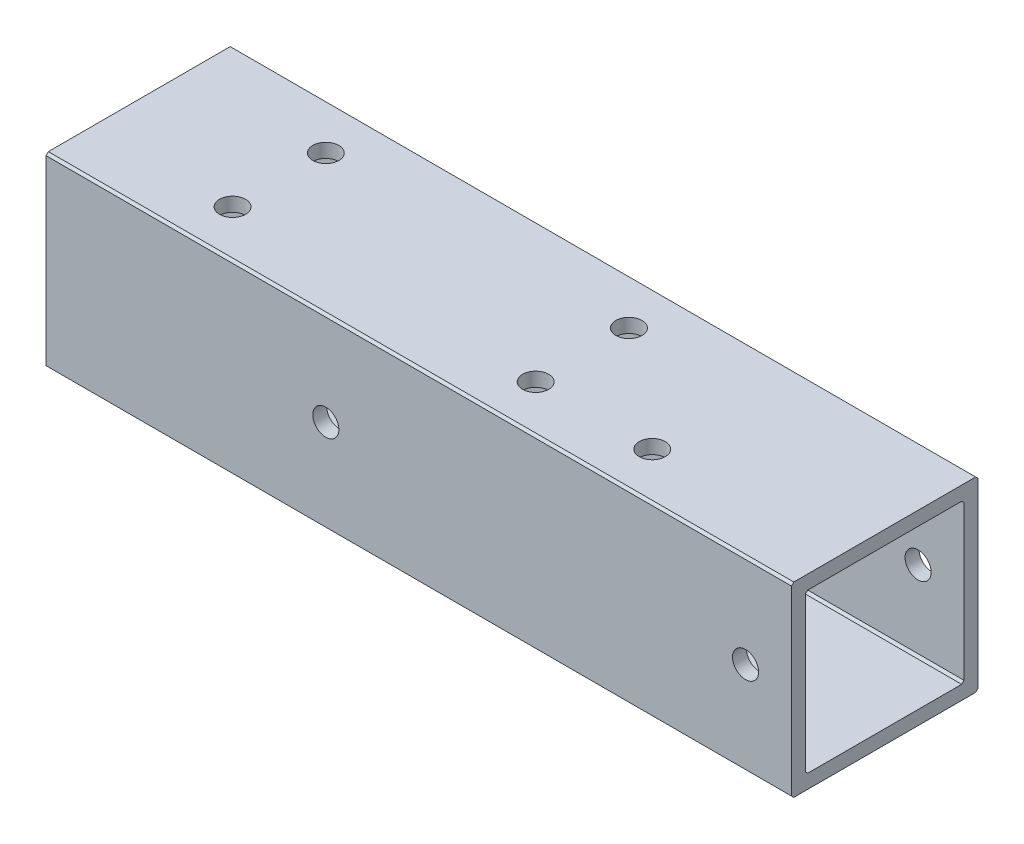
ISO-10303-21;
HEADER;
FILE_DESCRIPTION(('STEP AP214'),'2;1');
FILE_NAME('part.step','',(''),(''),'','','');
FILE_SCHEMA(('AUTOMOTIVE_DESIGN { 1 0 10303 214 1 1 1 1 }'));
ENDSEC;
DATA;
#1=APPLICATION_CONTEXT('core data for automotive mechanical design processes');
#2=APPLICATION_PROTOCOL_DEFINITION('international standard','automotive_design',2000,#1);
#3=PRODUCT_CONTEXT('',#1,'mechanical');
#4=PRODUCT('Part','Part','',(#3));
#5=PRODUCT_RELATED_PRODUCT_CATEGORY('part','',(#4));
#6=PRODUCT_DEFINITION_FORMATION('','',#4);
#7=PRODUCT_DEFINITION_CONTEXT('part definition',#1,'design');
#8=PRODUCT_DEFINITION('design','',#6,#7);
#9=PRODUCT_DEFINITION_SHAPE('','',#8);
#10=(LENGTH_UNIT() NAMED_UNIT(*) SI_UNIT(.MILLI.,.METRE.));
#11=(NAMED_UNIT(*) PLANE_ANGLE_UNIT() SI_UNIT($,.RADIAN.));
#12=(NAMED_UNIT(*) SI_UNIT($,.STERADIAN.) SOLID_ANGLE_UNIT());
#13=UNCERTAINTY_MEASURE_WITH_UNIT(LENGTH_MEASURE(1.E-05),#10,'distance_accuracy_value','');
#14=(GEOMETRIC_REPRESENTATION_CONTEXT(3) GLOBAL_UNCERTAINTY_ASSIGNED_CONTEXT((#13)) GLOBAL_UNIT_ASSIGNED_CONTEXT((#10,
#11,#12)) REPRESENTATION_CONTEXT('',''));
#15=CARTESIAN_POINT('',(0.,0.,0.));
#16=DIRECTION('',(0.,0.,1.));
#17=DIRECTION('',(1.,0.,0.));
#18=AXIS2_PLACEMENT_3D('',#15,#16,#17);
#19=CARTESIAN_POINT('',(-250.,-142.,140.));
#20=DIRECTION('',(0.,0.,1.));
#21=DIRECTION('',(1.,0.,0.));
#22=AXIS2_PLACEMENT_3D('',#19,#20,#21);
#23=PLANE('',#22);
#24=CARTESIAN_POINT('',(-100.,-122.,140.));
#25=DIRECTION('',(0.,0.,-1.));
#26=DIRECTION('',(-1.,0.,0.));
#27=AXIS2_PLACEMENT_3D('',#24,#25,#26);
#28=CIRCLE('',#27,2.79999999999998);
#29=CARTESIAN_POINT('',(-102.8,-122.,140.));
#30=VERTEX_POINT('',#29);
#31=EDGE_CURVE('E581',#30,#30,#28,.T.);
#32=ORIENTED_EDGE('',*,*,#31,.T.);
#33=EDGE_LOOP('',(#32));
#34=FACE_BOUND('',#33,.T.);
#35=CARTESIAN_POINT('',(-190.,-122.,140.));
#36=DIRECTION('',(0.,0.,-1.));
#37=DIRECTION('',(-1.,0.,0.));
#38=AXIS2_PLACEMENT_3D('',#35,#36,#37);
#39=CIRCLE('',#38,2.8);
#40=CARTESIAN_POINT('',(-192.8,-122.,140.));
#41=VERTEX_POINT('',#40);
#42=EDGE_CURVE('E593',#41,#41,#39,.T.);
#43=ORIENTED_EDGE('',*,*,#42,.T.);
#44=EDGE_LOOP('',(#43));
#45=FACE_BOUND('',#44,.T.);
#46=DIRECTION('',(0.,1.,0.));
#47=VECTOR('',#46,1.);
#48=CARTESIAN_POINT('',(-90.15,-142.,140.));
#49=LINE('',#48,#47);
#50=CARTESIAN_POINT('',(-90.15,-141.5,140.));
#51=VERTEX_POINT('',#50);
#52=CARTESIAN_POINT('',(-90.15,-102.5,140.));
#53=VERTEX_POINT('',#52);
#54=EDGE_CURVE('E185',#51,#53,#49,.T.);
#55=ORIENTED_EDGE('',*,*,#54,.T.);
#56=DIRECTION('',(-1.,0.,0.));
#57=VECTOR('',#56,1.);
#58=CARTESIAN_POINT('',(-250.,-102.5,140.));
#59=LINE('',#58,#57);
#60=CARTESIAN_POINT('',(-250.,-102.5,140.));
#61=VERTEX_POINT('',#60);
#62=EDGE_CURVE('E229',#53,#61,#59,.T.);
#63=ORIENTED_EDGE('',*,*,#62,.T.);
#64=DIRECTION('',(0.,1.,0.));
#65=VECTOR('',#64,1.);
#66=CARTESIAN_POINT('',(-250.,-142.,140.));
#67=LINE('',#66,#65);
#68=CARTESIAN_POINT('',(-250.,-141.5,140.));
#69=VERTEX_POINT('',#68);
#70=EDGE_CURVE('E196',#69,#61,#67,.T.);
#71=ORIENTED_EDGE('',*,*,#70,.F.);
#72=DIRECTION('',(1.,0.,0.));
#73=VECTOR('',#72,1.);
#74=CARTESIAN_POINT('',(-90.15,-141.5,140.));
#75=LINE('',#74,#73);
#76=EDGE_CURVE('E226',#69,#51,#75,.T.);
#77=ORIENTED_EDGE('',*,*,#76,.T.);
#78=EDGE_LOOP('',(#55,#63,#71,#77));
#79=FACE_BOUND('',#78,.T.);
#80=ADVANCED_FACE('F45',(#34,#45,#79),#23,.T.);
#81=CARTESIAN_POINT('',(-250.,-142.,100.));
#82=DIRECTION('',(-1.,0.,0.));
#83=DIRECTION('',(0.,0.,1.));
#84=AXIS2_PLACEMENT_3D('',#81,#82,#83);
#85=PLANE('',#84);
#86=DIRECTION('',(0.,-1.,0.));
#87=VECTOR('',#86,1.);
#88=CARTESIAN_POINT('',(-250.,-105.,103.));
#89=LINE('',#88,#87);
#90=CARTESIAN_POINT('',(-250.,-105.5,103.));
#91=VERTEX_POINT('',#90);
#92=CARTESIAN_POINT('',(-250.,-138.5,103.));
#93=VERTEX_POINT('',#92);
#94=EDGE_CURVE('E286',#91,#93,#89,.T.);
#95=ORIENTED_EDGE('',*,*,#94,.F.);
#96=DIRECTION('',(0.,-0.707106781186548,-0.707106781186548));
#97=VECTOR('',#96,1.);
#98=CARTESIAN_POINT('',(-250.,-105.5,103.));
#99=LINE('',#98,#97);
#100=CARTESIAN_POINT('',(-250.,-105.,103.5));
#101=VERTEX_POINT('',#100);
#102=EDGE_CURVE('E55',#91,#101,#99,.F.);
#103=ORIENTED_EDGE('',*,*,#102,.T.);
#104=DIRECTION('',(0.,0.,-1.));
#105=VECTOR('',#104,1.);
#106=CARTESIAN_POINT('',(-250.,-105.,137.));
#107=LINE('',#106,#105);
#108=CARTESIAN_POINT('',(-250.,-105.,136.5));
#109=VERTEX_POINT('',#108);
#110=EDGE_CURVE('E284',#109,#101,#107,.T.);
#111=ORIENTED_EDGE('',*,*,#110,.F.);
#112=DIRECTION('',(0.,0.707106781186548,-0.707106781186548));
#113=VECTOR('',#112,1.);
#114=CARTESIAN_POINT('',(-250.,-105.,136.5));
#115=LINE('',#114,#113);
#116=CARTESIAN_POINT('',(-250.,-105.5,137.));
#117=VERTEX_POINT('',#116);
#118=EDGE_CURVE('E260',#109,#117,#115,.F.);
#119=ORIENTED_EDGE('',*,*,#118,.T.);
#120=DIRECTION('',(0.,1.,0.));
#121=VECTOR('',#120,1.);
#122=CARTESIAN_POINT('',(-250.,-139.,137.));
#123=LINE('',#122,#121);
#124=CARTESIAN_POINT('',(-250.,-138.5,137.));
#125=VERTEX_POINT('',#124);
#126=EDGE_CURVE('E297',#125,#117,#123,.T.);
#127=ORIENTED_EDGE('',*,*,#126,.F.);
#128=DIRECTION('',(0.,0.707106781186528,0.707106781186567));
#129=VECTOR('',#128,1.);
#130=CARTESIAN_POINT('',(-250.,-138.5,137.));
#131=LINE('',#130,#129);
#132=CARTESIAN_POINT('',(-250.,-139.,136.5));
#133=VERTEX_POINT('',#132);
#134=EDGE_CURVE('E272',#125,#133,#131,.F.);
#135=ORIENTED_EDGE('',*,*,#134,.T.);
#136=DIRECTION('',(0.,0.,1.));
#137=VECTOR('',#136,1.);
#138=CARTESIAN_POINT('',(-250.,-139.,103.));
#139=LINE('',#138,#137);
#140=CARTESIAN_POINT('',(-250.,-139.,103.5));
#141=VERTEX_POINT('',#140);
#142=EDGE_CURVE('E327',#141,#133,#139,.T.);
#143=ORIENTED_EDGE('',*,*,#142,.F.);
#144=DIRECTION('',(0.,-0.707106781186567,0.707106781186528));
#145=VECTOR('',#144,1.);
#146=CARTESIAN_POINT('',(-250.,-139.,103.5));
#147=LINE('',#146,#145);
#148=EDGE_CURVE('E266',#141,#93,#147,.F.);
#149=ORIENTED_EDGE('',*,*,#148,.T.);
#150=EDGE_LOOP('',(#95,#103,#111,#119,#127,#135,#143,#149));
#151=FACE_BOUND('',#150,.T.);
#152=DIRECTION('',(0.,1.,0.));
#153=VECTOR('',#152,1.);
#154=CARTESIAN_POINT('',(-250.,-142.,100.));
#155=LINE('',#154,#153);
#156=CARTESIAN_POINT('',(-250.,-141.5,100.));
#157=VERTEX_POINT('',#156);
#158=CARTESIAN_POINT('',(-250.,-102.5,100.));
#159=VERTEX_POINT('',#158);
#160=EDGE_CURVE('E184',#157,#159,#155,.T.);
#161=ORIENTED_EDGE('',*,*,#160,.F.);
#162=DIRECTION('',(0.,-0.707106781186548,0.707106781186548));
#163=VECTOR('',#162,1.);
#164=CARTESIAN_POINT('',(-250.,-141.75,100.25));
#165=LINE('',#164,#163);
#166=CARTESIAN_POINT('',(-250.,-142.,100.5));
#167=VERTEX_POINT('',#166);
#168=EDGE_CURVE('E188',#157,#167,#165,.T.);
#169=ORIENTED_EDGE('',*,*,#168,.T.);
#170=DIRECTION('',(0.,0.,1.));
#171=VECTOR('',#170,1.);
#172=CARTESIAN_POINT('',(-250.,-142.,100.));
#173=LINE('',#172,#171);
#174=CARTESIAN_POINT('',(-250.,-142.,139.5));
#175=VERTEX_POINT('',#174);
#176=EDGE_CURVE('E336',#167,#175,#173,.T.);
#177=ORIENTED_EDGE('',*,*,#176,.T.);
#178=DIRECTION('',(0.,0.707106781186528,0.707106781186567));
#179=VECTOR('',#178,1.);
#180=CARTESIAN_POINT('',(-250.,-161.75,119.749999999999));
#181=LINE('',#180,#179);
#182=EDGE_CURVE('E190',#175,#69,#181,.T.);
#183=ORIENTED_EDGE('',*,*,#182,.T.);
#184=ORIENTED_EDGE('',*,*,#70,.T.);
#185=DIRECTION('',(0.,-0.707106781186548,0.707106781186548));
#186=VECTOR('',#185,1.);
#187=CARTESIAN_POINT('',(-250.,-102.25,139.75));
#188=LINE('',#187,#186);
#189=CARTESIAN_POINT('',(-250.,-102.,139.5));
#190=VERTEX_POINT('',#189);
#191=EDGE_CURVE('E194',#61,#190,#188,.F.);
#192=ORIENTED_EDGE('',*,*,#191,.T.);
#193=DIRECTION('',(0.,0.,1.));
#194=VECTOR('',#193,1.);
#195=CARTESIAN_POINT('',(-250.,-102.,100.));
#196=LINE('',#195,#194);
#197=CARTESIAN_POINT('',(-250.,-102.,100.5));
#198=VERTEX_POINT('',#197);
#199=EDGE_CURVE('E337',#198,#190,#196,.T.);
#200=ORIENTED_EDGE('',*,*,#199,.F.);
#201=DIRECTION('',(0.,0.707106781186548,0.707106781186548));
#202=VECTOR('',#201,1.);
#203=CARTESIAN_POINT('',(-250.,-122.25,80.25));
#204=LINE('',#203,#202);
#205=EDGE_CURVE('E202',#198,#159,#204,.F.);
#206=ORIENTED_EDGE('',*,*,#205,.T.);
#207=EDGE_LOOP('',(#161,#169,#177,#183,#184,#192,#200,#206));
#208=FACE_BOUND('',#207,.T.);
#209=ADVANCED_FACE('F282',(#151,#208),#85,.T.);
#210=CARTESIAN_POINT('',(-90.15,-142.,100.));
#211=DIRECTION('',(0.,0.,-1.));
#212=DIRECTION('',(-1.,0.,0.));
#213=AXIS2_PLACEMENT_3D('',#210,#211,#212);
#214=PLANE('',#213);
#215=CARTESIAN_POINT('',(-100.,-122.,100.));
#216=DIRECTION('',(0.,0.,-1.));
#217=DIRECTION('',(-1.,0.,0.));
#218=AXIS2_PLACEMENT_3D('',#215,#216,#217);
#219=CIRCLE('',#218,2.79999999999998);
#220=CARTESIAN_POINT('',(-102.8,-122.,100.));
#221=VERTEX_POINT('',#220);
#222=EDGE_CURVE('E476',#221,#221,#219,.T.);
#223=ORIENTED_EDGE('',*,*,#222,.F.);
#224=EDGE_LOOP('',(#223));
#225=FACE_BOUND('',#224,.T.);
#226=CARTESIAN_POINT('',(-190.,-122.,100.));
#227=DIRECTION('',(0.,0.,-1.));
#228=DIRECTION('',(-1.,0.,0.));
#229=AXIS2_PLACEMENT_3D('',#226,#227,#228);
#230=CIRCLE('',#229,2.8);
#231=CARTESIAN_POINT('',(-192.8,-122.,100.));
#232=VERTEX_POINT('',#231);
#233=EDGE_CURVE('E479',#232,#232,#230,.T.);
#234=ORIENTED_EDGE('',*,*,#233,.F.);
#235=EDGE_LOOP('',(#234));
#236=FACE_BOUND('',#235,.T.);
#237=DIRECTION('',(0.,1.,0.));
#238=VECTOR('',#237,1.);
#239=CARTESIAN_POINT('',(-90.15,-142.,100.));
#240=LINE('',#239,#238);
#241=CARTESIAN_POINT('',(-90.15,-141.5,100.));
#242=VERTEX_POINT('',#241);
#243=CARTESIAN_POINT('',(-90.15,-102.5,100.));
#244=VERTEX_POINT('',#243);
#245=EDGE_CURVE('E164',#242,#244,#240,.T.);
#246=ORIENTED_EDGE('',*,*,#245,.F.);
#247=DIRECTION('',(-1.,0.,0.));
#248=VECTOR('',#247,1.);
#249=CARTESIAN_POINT('',(-250.,-141.5,100.));
#250=LINE('',#249,#248);
#251=EDGE_CURVE('E179',#242,#157,#250,.T.);
#252=ORIENTED_EDGE('',*,*,#251,.T.);
#253=ORIENTED_EDGE('',*,*,#160,.T.);
#254=DIRECTION('',(1.,0.,0.));
#255=VECTOR('',#254,1.);
#256=CARTESIAN_POINT('',(-90.15,-102.5,100.));
#257=LINE('',#256,#255);
#258=EDGE_CURVE('E182',#159,#244,#257,.T.);
#259=ORIENTED_EDGE('',*,*,#258,.T.);
#260=EDGE_LOOP('',(#246,#252,#253,#259));
#261=FACE_BOUND('',#260,.T.);
#262=ADVANCED_FACE('F177',(#225,#236,#261),#214,.T.);
#263=CARTESIAN_POINT('',(-90.15,-142.,140.));
#264=DIRECTION('',(1.,0.,0.));
#265=DIRECTION('',(0.,0.,-1.));
#266=AXIS2_PLACEMENT_3D('',#263,#264,#265);
#267=PLANE('',#266);
#268=DIRECTION('',(0.,0.,-1.));
#269=VECTOR('',#268,1.);
#270=CARTESIAN_POINT('',(-90.15,-105.,137.));
#271=LINE('',#270,#269);
#272=CARTESIAN_POINT('',(-90.15,-105.,136.5));
#273=VERTEX_POINT('',#272);
#274=CARTESIAN_POINT('',(-90.15,-105.,103.5));
#275=VERTEX_POINT('',#274);
#276=EDGE_CURVE('E304',#273,#275,#271,.T.);
#277=ORIENTED_EDGE('',*,*,#276,.T.);
#278=DIRECTION('',(0.,0.707106781186548,0.707106781186548));
#279=VECTOR('',#278,1.);
#280=CARTESIAN_POINT('',(-90.15,-105.5,103.));
#281=LINE('',#280,#279);
#282=CARTESIAN_POINT('',(-90.15,-105.5,103.));
#283=VERTEX_POINT('',#282);
#284=EDGE_CURVE('E11',#275,#283,#281,.F.);
#285=ORIENTED_EDGE('',*,*,#284,.T.);
#286=DIRECTION('',(0.,-1.,0.));
#287=VECTOR('',#286,1.);
#288=CARTESIAN_POINT('',(-90.15,-105.,103.));
#289=LINE('',#288,#287);
#290=CARTESIAN_POINT('',(-90.15,-138.5,103.));
#291=VERTEX_POINT('',#290);
#292=EDGE_CURVE('E296',#283,#291,#289,.T.);
#293=ORIENTED_EDGE('',*,*,#292,.T.);
#294=DIRECTION('',(0.,0.707106781186567,-0.707106781186528));
#295=VECTOR('',#294,1.);
#296=CARTESIAN_POINT('',(-90.15,-139.,103.5));
#297=LINE('',#296,#295);
#298=CARTESIAN_POINT('',(-90.15,-139.,103.5));
#299=VERTEX_POINT('',#298);
#300=EDGE_CURVE('E269',#291,#299,#297,.F.);
#301=ORIENTED_EDGE('',*,*,#300,.T.);
#302=DIRECTION('',(0.,0.,1.));
#303=VECTOR('',#302,1.);
#304=CARTESIAN_POINT('',(-90.15,-139.,103.));
#305=LINE('',#304,#303);
#306=CARTESIAN_POINT('',(-90.15,-139.,136.5));
#307=VERTEX_POINT('',#306);
#308=EDGE_CURVE('E309',#299,#307,#305,.T.);
#309=ORIENTED_EDGE('',*,*,#308,.T.);
#310=DIRECTION('',(0.,-0.707106781186528,-0.707106781186567));
#311=VECTOR('',#310,1.);
#312=CARTESIAN_POINT('',(-90.15,-138.5,137.));
#313=LINE('',#312,#311);
#314=CARTESIAN_POINT('',(-90.15,-138.5,137.));
#315=VERTEX_POINT('',#314);
#316=EDGE_CURVE('E275',#307,#315,#313,.F.);
#317=ORIENTED_EDGE('',*,*,#316,.T.);
#318=DIRECTION('',(0.,1.,0.));
#319=VECTOR('',#318,1.);
#320=CARTESIAN_POINT('',(-90.15,-139.,137.));
#321=LINE('',#320,#319);
#322=CARTESIAN_POINT('',(-90.15,-105.5,137.));
#323=VERTEX_POINT('',#322);
#324=EDGE_CURVE('E313',#315,#323,#321,.T.);
#325=ORIENTED_EDGE('',*,*,#324,.T.);
#326=DIRECTION('',(0.,-0.707106781186548,0.707106781186548));
#327=VECTOR('',#326,1.);
#328=CARTESIAN_POINT('',(-90.15,-105.,136.5));
#329=LINE('',#328,#327);
#330=EDGE_CURVE('E263',#323,#273,#329,.F.);
#331=ORIENTED_EDGE('',*,*,#330,.T.);
#332=EDGE_LOOP('',(#277,#285,#293,#301,#309,#317,#325,#331));
#333=FACE_BOUND('',#332,.T.);
#334=DIRECTION('',(0.,0.,-1.));
#335=VECTOR('',#334,1.);
#336=CARTESIAN_POINT('',(-90.15,-142.,140.));
#337=LINE('',#336,#335);
#338=CARTESIAN_POINT('',(-90.15,-142.,139.5));
#339=VERTEX_POINT('',#338);
#340=CARTESIAN_POINT('',(-90.15,-142.,100.5));
#341=VERTEX_POINT('',#340);
#342=EDGE_CURVE('E167',#339,#341,#337,.T.);
#343=ORIENTED_EDGE('',*,*,#342,.T.);
#344=DIRECTION('',(0.,0.707106781186548,-0.707106781186548));
#345=VECTOR('',#344,1.);
#346=CARTESIAN_POINT('',(-90.15,-161.75,120.25));
#347=LINE('',#346,#345);
#348=EDGE_CURVE('E161',#341,#242,#347,.T.);
#349=ORIENTED_EDGE('',*,*,#348,.T.);
#350=ORIENTED_EDGE('',*,*,#245,.T.);
#351=DIRECTION('',(0.,-0.707106781186548,-0.707106781186548));
#352=VECTOR('',#351,1.);
#353=CARTESIAN_POINT('',(-90.15,-102.25,100.25));
#354=LINE('',#353,#352);
#355=CARTESIAN_POINT('',(-90.15,-102.,100.5));
#356=VERTEX_POINT('',#355);
#357=EDGE_CURVE('E173',#244,#356,#354,.F.);
#358=ORIENTED_EDGE('',*,*,#357,.T.);
#359=DIRECTION('',(0.,0.,-1.));
#360=VECTOR('',#359,1.);
#361=CARTESIAN_POINT('',(-90.15,-102.,140.));
#362=LINE('',#361,#360);
#363=CARTESIAN_POINT('',(-90.15,-102.,139.5));
#364=VERTEX_POINT('',#363);
#365=EDGE_CURVE('E324',#364,#356,#362,.T.);
#366=ORIENTED_EDGE('',*,*,#365,.F.);
#367=DIRECTION('',(0.,0.707106781186548,-0.707106781186548));
#368=VECTOR('',#367,1.);
#369=CARTESIAN_POINT('',(-90.15,-122.25,159.75));
#370=LINE('',#369,#368);
#371=EDGE_CURVE('E62',#364,#53,#370,.F.);
#372=ORIENTED_EDGE('',*,*,#371,.T.);
#373=ORIENTED_EDGE('',*,*,#54,.F.);
#374=DIRECTION('',(0.,-0.707106781186528,-0.707106781186567));
#375=VECTOR('',#374,1.);
#376=CARTESIAN_POINT('',(-90.15,-141.75,139.75));
#377=LINE('',#376,#375);
#378=EDGE_CURVE('E70',#51,#339,#377,.T.);
#379=ORIENTED_EDGE('',*,*,#378,.T.);
#380=EDGE_LOOP('',(#343,#349,#350,#358,#366,#372,#373,#379));
#381=FACE_BOUND('',#380,.T.);
#382=ADVANCED_FACE('F163',(#333,#381),#267,.T.);
#383=CARTESIAN_POINT('',(0.,-142.,0.));
#384=DIRECTION('',(0.,1.,0.));
#385=DIRECTION('',(0.,0.,1.));
#386=AXIS2_PLACEMENT_3D('',#383,#384,#385);
#387=PLANE('',#386);
#388=CARTESIAN_POINT('',(-130.,-142.,130.));
#389=DIRECTION('',(0.,1.,0.));
#390=DIRECTION('',(0.,0.,1.));
#391=AXIS2_PLACEMENT_3D('',#388,#389,#390);
#392=CIRCLE('',#391,2.8);
#393=CARTESIAN_POINT('',(-130.,-142.,132.8));
#394=VERTEX_POINT('',#393);
#395=EDGE_CURVE('E497',#394,#394,#392,.T.);
#396=ORIENTED_EDGE('',*,*,#395,.T.);
#397=EDGE_LOOP('',(#396));
#398=FACE_BOUND('',#397,.T.);
#399=CARTESIAN_POINT('',(-155.,-142.,130.));
#400=DIRECTION('',(0.,1.,0.));
#401=DIRECTION('',(0.,0.,1.));
#402=AXIS2_PLACEMENT_3D('',#399,#400,#401);
#403=CIRCLE('',#402,2.8);
#404=CARTESIAN_POINT('',(-155.,-142.,132.8));
#405=VERTEX_POINT('',#404);
#406=EDGE_CURVE('E505',#405,#405,#403,.T.);
#407=ORIENTED_EDGE('',*,*,#406,.T.);
#408=EDGE_LOOP('',(#407));
#409=FACE_BOUND('',#408,.T.);
#410=CARTESIAN_POINT('',(-155.,-142.,110.));
#411=DIRECTION('',(0.,1.,0.));
#412=DIRECTION('',(0.,0.,1.));
#413=AXIS2_PLACEMENT_3D('',#410,#411,#412);
#414=CIRCLE('',#413,2.8);
#415=CARTESIAN_POINT('',(-155.,-142.,112.8));
#416=VERTEX_POINT('',#415);
#417=EDGE_CURVE('E513',#416,#416,#414,.T.);
#418=ORIENTED_EDGE('',*,*,#417,.T.);
#419=EDGE_LOOP('',(#418));
#420=FACE_BOUND('',#419,.T.);
#421=CARTESIAN_POINT('',(-220.,-142.,130.));
#422=DIRECTION('',(0.,1.,0.));
#423=DIRECTION('',(0.,0.,1.));
#424=AXIS2_PLACEMENT_3D('',#421,#422,#423);
#425=CIRCLE('',#424,2.8);
#426=CARTESIAN_POINT('',(-220.,-142.,132.8));
#427=VERTEX_POINT('',#426);
#428=EDGE_CURVE('E521',#427,#427,#425,.T.);
#429=ORIENTED_EDGE('',*,*,#428,.T.);
#430=EDGE_LOOP('',(#429));
#431=FACE_BOUND('',#430,.T.);
#432=CARTESIAN_POINT('',(-220.,-142.,110.));
#433=DIRECTION('',(0.,1.,0.));
#434=DIRECTION('',(0.,0.,1.));
#435=AXIS2_PLACEMENT_3D('',#432,#433,#434);
#436=CIRCLE('',#435,2.8);
#437=CARTESIAN_POINT('',(-220.,-142.,112.8));
#438=VERTEX_POINT('',#437);
#439=EDGE_CURVE('E316',#438,#438,#436,.T.);
#440=ORIENTED_EDGE('',*,*,#439,.T.);
#441=EDGE_LOOP('',(#440));
#442=FACE_BOUND('',#441,.T.);
#443=ORIENTED_EDGE('',*,*,#176,.F.);
#444=DIRECTION('',(1.,0.,0.));
#445=VECTOR('',#444,1.);
#446=CARTESIAN_POINT('',(-90.15,-142.,100.5));
#447=LINE('',#446,#445);
#448=EDGE_CURVE('E210',#167,#341,#447,.T.);
#449=ORIENTED_EDGE('',*,*,#448,.T.);
#450=ORIENTED_EDGE('',*,*,#342,.F.);
#451=DIRECTION('',(-1.,0.,0.));
#452=VECTOR('',#451,1.);
#453=CARTESIAN_POINT('',(-250.,-142.,139.5));
#454=LINE('',#453,#452);
#455=EDGE_CURVE('E207',#339,#175,#454,.T.);
#456=ORIENTED_EDGE('',*,*,#455,.T.);
#457=EDGE_LOOP('',(#443,#449,#450,#456));
#458=FACE_BOUND('',#457,.T.);
#459=ADVANCED_FACE('F368',(#398,#409,#420,#431,#442,#458),#387,.F.);
#460=CARTESIAN_POINT('',(0.,-102.,0.));
#461=DIRECTION('',(0.,1.,0.));
#462=DIRECTION('',(0.,0.,1.));
#463=AXIS2_PLACEMENT_3D('',#460,#461,#462);
#464=PLANE('',#463);
#465=CARTESIAN_POINT('',(-130.,-102.,130.));
#466=DIRECTION('',(0.,1.,0.));
#467=DIRECTION('',(0.,0.,1.));
#468=AXIS2_PLACEMENT_3D('',#465,#466,#467);
#469=CIRCLE('',#468,2.8);
#470=CARTESIAN_POINT('',(-130.,-102.,132.8));
#471=VERTEX_POINT('',#470);
#472=EDGE_CURVE('E894',#471,#471,#469,.T.);
#473=ORIENTED_EDGE('',*,*,#472,.F.);
#474=EDGE_LOOP('',(#473));
#475=FACE_BOUND('',#474,.T.);
#476=CARTESIAN_POINT('',(-155.,-102.,130.));
#477=DIRECTION('',(0.,1.,0.));
#478=DIRECTION('',(0.,0.,1.));
#479=AXIS2_PLACEMENT_3D('',#476,#477,#478);
#480=CIRCLE('',#479,2.8);
#481=CARTESIAN_POINT('',(-155.,-102.,132.8));
#482=VERTEX_POINT('',#481);
#483=EDGE_CURVE('E896',#482,#482,#480,.T.);
#484=ORIENTED_EDGE('',*,*,#483,.F.);
#485=EDGE_LOOP('',(#484));
#486=FACE_BOUND('',#485,.T.);
#487=CARTESIAN_POINT('',(-155.,-102.,110.));
#488=DIRECTION('',(0.,1.,0.));
#489=DIRECTION('',(0.,0.,1.));
#490=AXIS2_PLACEMENT_3D('',#487,#488,#489);
#491=CIRCLE('',#490,2.8);
#492=CARTESIAN_POINT('',(-155.,-102.,112.8));
#493=VERTEX_POINT('',#492);
#494=EDGE_CURVE('E906',#493,#493,#491,.T.);
#495=ORIENTED_EDGE('',*,*,#494,.F.);
#496=EDGE_LOOP('',(#495));
#497=FACE_BOUND('',#496,.T.);
#498=CARTESIAN_POINT('',(-220.,-102.,130.));
#499=DIRECTION('',(0.,1.,0.));
#500=DIRECTION('',(0.,0.,1.));
#501=AXIS2_PLACEMENT_3D('',#498,#499,#500);
#502=CIRCLE('',#501,2.8);
#503=CARTESIAN_POINT('',(-220.,-102.,132.8));
#504=VERTEX_POINT('',#503);
#505=EDGE_CURVE('E912',#504,#504,#502,.T.);
#506=ORIENTED_EDGE('',*,*,#505,.F.);
#507=EDGE_LOOP('',(#506));
#508=FACE_BOUND('',#507,.T.);
#509=CARTESIAN_POINT('',(-220.,-102.,110.));
#510=DIRECTION('',(0.,1.,0.));
#511=DIRECTION('',(0.,0.,1.));
#512=AXIS2_PLACEMENT_3D('',#509,#510,#511);
#513=CIRCLE('',#512,2.8);
#514=CARTESIAN_POINT('',(-220.,-102.,112.8));
#515=VERTEX_POINT('',#514);
#516=EDGE_CURVE('E576',#515,#515,#513,.T.);
#517=ORIENTED_EDGE('',*,*,#516,.F.);
#518=EDGE_LOOP('',(#517));
#519=FACE_BOUND('',#518,.T.);
#520=ORIENTED_EDGE('',*,*,#365,.T.);
#521=DIRECTION('',(-1.,0.,0.));
#522=VECTOR('',#521,1.);
#523=CARTESIAN_POINT('',(0.,-102.,100.5));
#524=LINE('',#523,#522);
#525=EDGE_CURVE('E222',#356,#198,#524,.T.);
#526=ORIENTED_EDGE('',*,*,#525,.T.);
#527=ORIENTED_EDGE('',*,*,#199,.T.);
#528=DIRECTION('',(1.,0.,0.));
#529=VECTOR('',#528,1.);
#530=CARTESIAN_POINT('',(0.,-102.,139.5));
#531=LINE('',#530,#529);
#532=EDGE_CURVE('E172',#190,#364,#531,.T.);
#533=ORIENTED_EDGE('',*,*,#532,.T.);
#534=EDGE_LOOP('',(#520,#526,#527,#533));
#535=FACE_BOUND('',#534,.T.);
#536=ADVANCED_FACE('F361',(#475,#486,#497,#508,#519,#535),#464,.T.);
#537=CARTESIAN_POINT('',(-90.15,-105.,103.));
#538=DIRECTION('',(0.,0.,-1.));
#539=DIRECTION('',(-1.,0.,0.));
#540=AXIS2_PLACEMENT_3D('',#537,#538,#539);
#541=PLANE('',#540);
#542=CARTESIAN_POINT('',(-100.,-122.,103.));
#543=DIRECTION('',(0.,0.,-1.));
#544=DIRECTION('',(-1.,0.,0.));
#545=AXIS2_PLACEMENT_3D('',#542,#543,#544);
#546=CIRCLE('',#545,2.79999999999999);
#547=CARTESIAN_POINT('',(-102.8,-122.,103.));
#548=VERTEX_POINT('',#547);
#549=EDGE_CURVE('E483',#548,#548,#546,.T.);
#550=ORIENTED_EDGE('',*,*,#549,.T.);
#551=EDGE_LOOP('',(#550));
#552=FACE_BOUND('',#551,.T.);
#553=CARTESIAN_POINT('',(-190.,-122.,103.));
#554=DIRECTION('',(0.,0.,-1.));
#555=DIRECTION('',(-1.,0.,0.));
#556=AXIS2_PLACEMENT_3D('',#553,#554,#555);
#557=CIRCLE('',#556,2.8);
#558=CARTESIAN_POINT('',(-192.8,-122.,103.));
#559=VERTEX_POINT('',#558);
#560=EDGE_CURVE('E482',#559,#559,#557,.T.);
#561=ORIENTED_EDGE('',*,*,#560,.T.);
#562=EDGE_LOOP('',(#561));
#563=FACE_BOUND('',#562,.T.);
#564=ORIENTED_EDGE('',*,*,#94,.T.);
#565=DIRECTION('',(1.,0.,0.));
#566=VECTOR('',#565,1.);
#567=CARTESIAN_POINT('',(-90.15,-138.5,103.));
#568=LINE('',#567,#566);
#569=EDGE_CURVE('E257',#93,#291,#568,.T.);
#570=ORIENTED_EDGE('',*,*,#569,.T.);
#571=ORIENTED_EDGE('',*,*,#292,.F.);
#572=DIRECTION('',(-1.,0.,0.));
#573=VECTOR('',#572,1.);
#574=CARTESIAN_POINT('',(-250.,-105.5,103.));
#575=LINE('',#574,#573);
#576=EDGE_CURVE('E253',#283,#91,#575,.T.);
#577=ORIENTED_EDGE('',*,*,#576,.T.);
#578=EDGE_LOOP('',(#564,#570,#571,#577));
#579=FACE_BOUND('',#578,.T.);
#580=ADVANCED_FACE('F306',(#552,#563,#579),#541,.F.);
#581=CARTESIAN_POINT('',(-90.15,-105.,137.));
#582=DIRECTION('',(0.,1.,0.));
#583=DIRECTION('',(0.,0.,1.));
#584=AXIS2_PLACEMENT_3D('',#581,#582,#583);
#585=PLANE('',#584);
#586=CARTESIAN_POINT('',(-130.,-105.,130.));
#587=DIRECTION('',(0.,1.,0.));
#588=DIRECTION('',(0.,0.,1.));
#589=AXIS2_PLACEMENT_3D('',#586,#587,#588);
#590=CIRCLE('',#589,2.79999999999998);
#591=CARTESIAN_POINT('',(-130.,-105.,132.8));
#592=VERTEX_POINT('',#591);
#593=EDGE_CURVE('E557',#592,#592,#590,.T.);
#594=ORIENTED_EDGE('',*,*,#593,.T.);
#595=EDGE_LOOP('',(#594));
#596=FACE_BOUND('',#595,.T.);
#597=CARTESIAN_POINT('',(-155.,-105.,130.));
#598=DIRECTION('',(0.,1.,0.));
#599=DIRECTION('',(0.,0.,1.));
#600=AXIS2_PLACEMENT_3D('',#597,#598,#599);
#601=CIRCLE('',#600,2.79999999999998);
#602=CARTESIAN_POINT('',(-155.,-105.,132.8));
#603=VERTEX_POINT('',#602);
#604=EDGE_CURVE('E561',#603,#603,#601,.T.);
#605=ORIENTED_EDGE('',*,*,#604,.T.);
#606=EDGE_LOOP('',(#605));
#607=FACE_BOUND('',#606,.T.);
#608=CARTESIAN_POINT('',(-155.,-105.,110.));
#609=DIRECTION('',(0.,1.,0.));
#610=DIRECTION('',(0.,0.,1.));
#611=AXIS2_PLACEMENT_3D('',#608,#609,#610);
#612=CIRCLE('',#611,2.79999999999998);
#613=CARTESIAN_POINT('',(-155.,-105.,112.8));
#614=VERTEX_POINT('',#613);
#615=EDGE_CURVE('E565',#614,#614,#612,.T.);
#616=ORIENTED_EDGE('',*,*,#615,.T.);
#617=EDGE_LOOP('',(#616));
#618=FACE_BOUND('',#617,.T.);
#619=CARTESIAN_POINT('',(-220.,-105.,130.));
#620=DIRECTION('',(0.,1.,0.));
#621=DIRECTION('',(0.,0.,1.));
#622=AXIS2_PLACEMENT_3D('',#619,#620,#621);
#623=CIRCLE('',#622,2.79999999999998);
#624=CARTESIAN_POINT('',(-220.,-105.,132.8));
#625=VERTEX_POINT('',#624);
#626=EDGE_CURVE('E569',#625,#625,#623,.T.);
#627=ORIENTED_EDGE('',*,*,#626,.T.);
#628=EDGE_LOOP('',(#627));
#629=FACE_BOUND('',#628,.T.);
#630=CARTESIAN_POINT('',(-220.,-105.,110.));
#631=DIRECTION('',(0.,1.,0.));
#632=DIRECTION('',(0.,0.,1.));
#633=AXIS2_PLACEMENT_3D('',#630,#631,#632);
#634=CIRCLE('',#633,2.79999999999998);
#635=CARTESIAN_POINT('',(-220.,-105.,112.8));
#636=VERTEX_POINT('',#635);
#637=EDGE_CURVE('E572',#636,#636,#634,.T.);
#638=ORIENTED_EDGE('',*,*,#637,.T.);
#639=EDGE_LOOP('',(#638));
#640=FACE_BOUND('',#639,.T.);
#641=ORIENTED_EDGE('',*,*,#276,.F.);
#642=DIRECTION('',(-1.,0.,0.));
#643=VECTOR('',#642,1.);
#644=CARTESIAN_POINT('',(-250.,-105.,136.5));
#645=LINE('',#644,#643);
#646=EDGE_CURVE('E235',#273,#109,#645,.T.);
#647=ORIENTED_EDGE('',*,*,#646,.T.);
#648=ORIENTED_EDGE('',*,*,#110,.T.);
#649=DIRECTION('',(1.,0.,0.));
#650=VECTOR('',#649,1.);
#651=CARTESIAN_POINT('',(-90.15,-105.,103.5));
#652=LINE('',#651,#650);
#653=EDGE_CURVE('E232',#101,#275,#652,.T.);
#654=ORIENTED_EDGE('',*,*,#653,.T.);
#655=EDGE_LOOP('',(#641,#647,#648,#654));
#656=FACE_BOUND('',#655,.T.);
#657=ADVANCED_FACE('F292',(#596,#607,#618,#629,#640,#656),#585,.F.);
#658=CARTESIAN_POINT('',(-90.15,-139.,137.));
#659=DIRECTION('',(0.,0.,1.));
#660=DIRECTION('',(1.,0.,0.));
#661=AXIS2_PLACEMENT_3D('',#658,#659,#660);
#662=PLANE('',#661);
#663=CARTESIAN_POINT('',(-100.,-122.,137.));
#664=DIRECTION('',(0.,0.,-1.));
#665=DIRECTION('',(-1.,0.,0.));
#666=AXIS2_PLACEMENT_3D('',#663,#664,#665);
#667=CIRCLE('',#666,2.79999999999998);
#668=CARTESIAN_POINT('',(-102.8,-122.,137.));
#669=VERTEX_POINT('',#668);
#670=EDGE_CURVE('E575',#669,#669,#667,.T.);
#671=ORIENTED_EDGE('',*,*,#670,.F.);
#672=EDGE_LOOP('',(#671));
#673=FACE_BOUND('',#672,.T.);
#674=CARTESIAN_POINT('',(-190.,-122.,137.));
#675=DIRECTION('',(0.,0.,-1.));
#676=DIRECTION('',(-1.,0.,0.));
#677=AXIS2_PLACEMENT_3D('',#674,#675,#676);
#678=CIRCLE('',#677,2.8);
#679=CARTESIAN_POINT('',(-192.8,-122.,137.));
#680=VERTEX_POINT('',#679);
#681=EDGE_CURVE('E589',#680,#680,#678,.T.);
#682=ORIENTED_EDGE('',*,*,#681,.F.);
#683=EDGE_LOOP('',(#682));
#684=FACE_BOUND('',#683,.T.);
#685=ORIENTED_EDGE('',*,*,#126,.T.);
#686=DIRECTION('',(1.,0.,0.));
#687=VECTOR('',#686,1.);
#688=CARTESIAN_POINT('',(-90.15,-105.5,137.));
#689=LINE('',#688,#687);
#690=EDGE_CURVE('E243',#117,#323,#689,.T.);
#691=ORIENTED_EDGE('',*,*,#690,.T.);
#692=ORIENTED_EDGE('',*,*,#324,.F.);
#693=DIRECTION('',(-1.,0.,0.));
#694=VECTOR('',#693,1.);
#695=CARTESIAN_POINT('',(-250.,-138.5,137.));
#696=LINE('',#695,#694);
#697=EDGE_CURVE('E239',#315,#125,#696,.T.);
#698=ORIENTED_EDGE('',*,*,#697,.T.);
#699=EDGE_LOOP('',(#685,#691,#692,#698));
#700=FACE_BOUND('',#699,.T.);
#701=ADVANCED_FACE('F436',(#673,#684,#700),#662,.F.);
#702=CARTESIAN_POINT('',(-90.15,-139.,103.));
#703=DIRECTION('',(0.,-1.,0.));
#704=DIRECTION('',(0.,0.,-1.));
#705=AXIS2_PLACEMENT_3D('',#702,#703,#704);
#706=PLANE('',#705);
#707=CARTESIAN_POINT('',(-130.,-139.,130.));
#708=DIRECTION('',(0.,1.,0.));
#709=DIRECTION('',(0.,0.,1.));
#710=AXIS2_PLACEMENT_3D('',#707,#708,#709);
#711=CIRCLE('',#710,2.8);
#712=CARTESIAN_POINT('',(-130.,-139.,132.8));
#713=VERTEX_POINT('',#712);
#714=EDGE_CURVE('E488',#713,#713,#711,.T.);
#715=ORIENTED_EDGE('',*,*,#714,.F.);
#716=EDGE_LOOP('',(#715));
#717=FACE_BOUND('',#716,.T.);
#718=CARTESIAN_POINT('',(-155.,-139.,130.));
#719=DIRECTION('',(0.,1.,0.));
#720=DIRECTION('',(0.,0.,1.));
#721=AXIS2_PLACEMENT_3D('',#718,#719,#720);
#722=CIRCLE('',#721,2.8);
#723=CARTESIAN_POINT('',(-155.,-139.,132.8));
#724=VERTEX_POINT('',#723);
#725=EDGE_CURVE('E501',#724,#724,#722,.T.);
#726=ORIENTED_EDGE('',*,*,#725,.F.);
#727=EDGE_LOOP('',(#726));
#728=FACE_BOUND('',#727,.T.);
#729=CARTESIAN_POINT('',(-155.,-139.,110.));
#730=DIRECTION('',(0.,1.,0.));
#731=DIRECTION('',(0.,0.,1.));
#732=AXIS2_PLACEMENT_3D('',#729,#730,#731);
#733=CIRCLE('',#732,2.8);
#734=CARTESIAN_POINT('',(-155.,-139.,112.8));
#735=VERTEX_POINT('',#734);
#736=EDGE_CURVE('E509',#735,#735,#733,.T.);
#737=ORIENTED_EDGE('',*,*,#736,.F.);
#738=EDGE_LOOP('',(#737));
#739=FACE_BOUND('',#738,.T.);
#740=CARTESIAN_POINT('',(-220.,-139.,130.));
#741=DIRECTION('',(0.,1.,0.));
#742=DIRECTION('',(0.,0.,1.));
#743=AXIS2_PLACEMENT_3D('',#740,#741,#742);
#744=CIRCLE('',#743,2.8);
#745=CARTESIAN_POINT('',(-220.,-139.,132.8));
#746=VERTEX_POINT('',#745);
#747=EDGE_CURVE('E517',#746,#746,#744,.T.);
#748=ORIENTED_EDGE('',*,*,#747,.F.);
#749=EDGE_LOOP('',(#748));
#750=FACE_BOUND('',#749,.T.);
#751=CARTESIAN_POINT('',(-220.,-139.,110.));
#752=DIRECTION('',(0.,1.,0.));
#753=DIRECTION('',(0.,0.,1.));
#754=AXIS2_PLACEMENT_3D('',#751,#752,#753);
#755=CIRCLE('',#754,2.8);
#756=CARTESIAN_POINT('',(-220.,-139.,112.8));
#757=VERTEX_POINT('',#756);
#758=EDGE_CURVE('E524',#757,#757,#755,.T.);
#759=ORIENTED_EDGE('',*,*,#758,.F.);
#760=EDGE_LOOP('',(#759));
#761=FACE_BOUND('',#760,.T.);
#762=ORIENTED_EDGE('',*,*,#308,.F.);
#763=DIRECTION('',(-1.,0.,0.));
#764=VECTOR('',#763,1.);
#765=CARTESIAN_POINT('',(-250.,-139.,103.5));
#766=LINE('',#765,#764);
#767=EDGE_CURVE('E249',#299,#141,#766,.T.);
#768=ORIENTED_EDGE('',*,*,#767,.T.);
#769=ORIENTED_EDGE('',*,*,#142,.T.);
#770=DIRECTION('',(1.,0.,0.));
#771=VECTOR('',#770,1.);
#772=CARTESIAN_POINT('',(-90.15,-139.,136.5));
#773=LINE('',#772,#771);
#774=EDGE_CURVE('E246',#133,#307,#773,.T.);
#775=ORIENTED_EDGE('',*,*,#774,.T.);
#776=EDGE_LOOP('',(#762,#768,#769,#775));
#777=FACE_BOUND('',#776,.T.);
#778=ADVANCED_FACE('F441',(#717,#728,#739,#750,#761,#777),#706,.F.);
#779=CARTESIAN_POINT('',(-220.,-139.,110.));
#780=DIRECTION('',(0.,1.,0.));
#781=DIRECTION('',(0.,0.,1.));
#782=AXIS2_PLACEMENT_3D('',#779,#780,#781);
#783=CYLINDRICAL_SURFACE('',#782,2.8);
#784=ORIENTED_EDGE('',*,*,#439,.F.);
#785=EDGE_LOOP('',(#784));
#786=FACE_BOUND('',#785,.T.);
#787=ORIENTED_EDGE('',*,*,#758,.T.);
#788=EDGE_LOOP('',(#787));
#789=FACE_BOUND('',#788,.T.);
#790=ADVANCED_FACE('F444',(#786,#789),#783,.F.);
#791=CARTESIAN_POINT('',(-220.,-139.,130.));
#792=DIRECTION('',(0.,1.,0.));
#793=DIRECTION('',(0.,0.,1.));
#794=AXIS2_PLACEMENT_3D('',#791,#792,#793);
#795=CYLINDRICAL_SURFACE('',#794,2.8);
#796=ORIENTED_EDGE('',*,*,#428,.F.);
#797=EDGE_LOOP('',(#796));
#798=FACE_BOUND('',#797,.T.);
#799=ORIENTED_EDGE('',*,*,#747,.T.);
#800=EDGE_LOOP('',(#799));
#801=FACE_BOUND('',#800,.T.);
#802=ADVANCED_FACE('F451',(#798,#801),#795,.F.);
#803=CARTESIAN_POINT('',(-155.,-139.,110.));
#804=DIRECTION('',(0.,1.,0.));
#805=DIRECTION('',(0.,0.,1.));
#806=AXIS2_PLACEMENT_3D('',#803,#804,#805);
#807=CYLINDRICAL_SURFACE('',#806,2.8);
#808=ORIENTED_EDGE('',*,*,#417,.F.);
#809=EDGE_LOOP('',(#808));
#810=FACE_BOUND('',#809,.T.);
#811=ORIENTED_EDGE('',*,*,#736,.T.);
#812=EDGE_LOOP('',(#811));
#813=FACE_BOUND('',#812,.T.);
#814=ADVANCED_FACE('F539',(#810,#813),#807,.F.);
#815=CARTESIAN_POINT('',(-155.,-139.,130.));
#816=DIRECTION('',(0.,1.,0.));
#817=DIRECTION('',(0.,0.,1.));
#818=AXIS2_PLACEMENT_3D('',#815,#816,#817);
#819=CYLINDRICAL_SURFACE('',#818,2.8);
#820=ORIENTED_EDGE('',*,*,#406,.F.);
#821=EDGE_LOOP('',(#820));
#822=FACE_BOUND('',#821,.T.);
#823=ORIENTED_EDGE('',*,*,#725,.T.);
#824=EDGE_LOOP('',(#823));
#825=FACE_BOUND('',#824,.T.);
#826=ADVANCED_FACE('F546',(#822,#825),#819,.F.);
#827=CARTESIAN_POINT('',(-130.,-139.,130.));
#828=DIRECTION('',(0.,1.,0.));
#829=DIRECTION('',(0.,0.,1.));
#830=AXIS2_PLACEMENT_3D('',#827,#828,#829);
#831=CYLINDRICAL_SURFACE('',#830,2.8);
#832=ORIENTED_EDGE('',*,*,#395,.F.);
#833=EDGE_LOOP('',(#832));
#834=FACE_BOUND('',#833,.T.);
#835=ORIENTED_EDGE('',*,*,#714,.T.);
#836=EDGE_LOOP('',(#835));
#837=FACE_BOUND('',#836,.T.);
#838=ADVANCED_FACE('F611',(#834,#837),#831,.F.);
#839=CARTESIAN_POINT('',(-190.,-122.,100.));
#840=DIRECTION('',(0.,0.,-1.));
#841=DIRECTION('',(-1.,0.,0.));
#842=AXIS2_PLACEMENT_3D('',#839,#840,#841);
#843=CYLINDRICAL_SURFACE('',#842,2.8);
#844=ORIENTED_EDGE('',*,*,#560,.F.);
#845=EDGE_LOOP('',(#844));
#846=FACE_BOUND('',#845,.T.);
#847=ORIENTED_EDGE('',*,*,#233,.T.);
#848=EDGE_LOOP('',(#847));
#849=FACE_BOUND('',#848,.T.);
#850=ADVANCED_FACE('F601',(#846,#849),#843,.F.);
#851=CARTESIAN_POINT('',(-100.,-122.,100.));
#852=DIRECTION('',(0.,0.,-1.));
#853=DIRECTION('',(-1.,0.,0.));
#854=AXIS2_PLACEMENT_3D('',#851,#852,#853);
#855=CYLINDRICAL_SURFACE('',#854,2.79999999999999);
#856=ORIENTED_EDGE('',*,*,#549,.F.);
#857=EDGE_LOOP('',(#856));
#858=FACE_BOUND('',#857,.T.);
#859=ORIENTED_EDGE('',*,*,#222,.T.);
#860=EDGE_LOOP('',(#859));
#861=FACE_BOUND('',#860,.T.);
#862=ADVANCED_FACE('F598',(#858,#861),#855,.F.);
#863=CARTESIAN_POINT('',(-190.,-122.,137.));
#864=DIRECTION('',(0.,0.,-1.));
#865=DIRECTION('',(-1.,0.,0.));
#866=AXIS2_PLACEMENT_3D('',#863,#864,#865);
#867=CYLINDRICAL_SURFACE('',#866,2.8);
#868=ORIENTED_EDGE('',*,*,#42,.F.);
#869=EDGE_LOOP('',(#868));
#870=FACE_BOUND('',#869,.T.);
#871=ORIENTED_EDGE('',*,*,#681,.T.);
#872=EDGE_LOOP('',(#871));
#873=FACE_BOUND('',#872,.T.);
#874=ADVANCED_FACE('F600',(#870,#873),#867,.F.);
#875=CARTESIAN_POINT('',(-100.,-122.,137.));
#876=DIRECTION('',(0.,0.,-1.));
#877=DIRECTION('',(-1.,0.,0.));
#878=AXIS2_PLACEMENT_3D('',#875,#876,#877);
#879=CYLINDRICAL_SURFACE('',#878,2.79999999999998);
#880=ORIENTED_EDGE('',*,*,#31,.F.);
#881=EDGE_LOOP('',(#880));
#882=FACE_BOUND('',#881,.T.);
#883=ORIENTED_EDGE('',*,*,#670,.T.);
#884=EDGE_LOOP('',(#883));
#885=FACE_BOUND('',#884,.T.);
#886=ADVANCED_FACE('F608',(#882,#885),#879,.F.);
#887=CARTESIAN_POINT('',(-220.,-102.,110.));
#888=DIRECTION('',(0.,1.,0.));
#889=DIRECTION('',(0.,0.,1.));
#890=AXIS2_PLACEMENT_3D('',#887,#888,#889);
#891=CYLINDRICAL_SURFACE('',#890,2.79999999999998);
#892=ORIENTED_EDGE('',*,*,#516,.T.);
#893=EDGE_LOOP('',(#892));
#894=FACE_BOUND('',#893,.T.);
#895=ORIENTED_EDGE('',*,*,#637,.F.);
#896=EDGE_LOOP('',(#895));
#897=FACE_BOUND('',#896,.T.);
#898=ADVANCED_FACE('F664',(#894,#897),#891,.F.);
#899=CARTESIAN_POINT('',(-220.,-102.,130.));
#900=DIRECTION('',(0.,1.,0.));
#901=DIRECTION('',(0.,0.,1.));
#902=AXIS2_PLACEMENT_3D('',#899,#900,#901);
#903=CYLINDRICAL_SURFACE('',#902,2.79999999999998);
#904=ORIENTED_EDGE('',*,*,#505,.T.);
#905=EDGE_LOOP('',(#904));
#906=FACE_BOUND('',#905,.T.);
#907=ORIENTED_EDGE('',*,*,#626,.F.);
#908=EDGE_LOOP('',(#907));
#909=FACE_BOUND('',#908,.T.);
#910=ADVANCED_FACE('F674',(#906,#909),#903,.F.);
#911=CARTESIAN_POINT('',(-155.,-102.,110.));
#912=DIRECTION('',(0.,1.,0.));
#913=DIRECTION('',(0.,0.,1.));
#914=AXIS2_PLACEMENT_3D('',#911,#912,#913);
#915=CYLINDRICAL_SURFACE('',#914,2.79999999999998);
#916=ORIENTED_EDGE('',*,*,#494,.T.);
#917=EDGE_LOOP('',(#916));
#918=FACE_BOUND('',#917,.T.);
#919=ORIENTED_EDGE('',*,*,#615,.F.);
#920=EDGE_LOOP('',(#919));
#921=FACE_BOUND('',#920,.T.);
#922=ADVANCED_FACE('F685',(#918,#921),#915,.F.);
#923=CARTESIAN_POINT('',(-155.,-102.,130.));
#924=DIRECTION('',(0.,1.,0.));
#925=DIRECTION('',(0.,0.,1.));
#926=AXIS2_PLACEMENT_3D('',#923,#924,#925);
#927=CYLINDRICAL_SURFACE('',#926,2.79999999999998);
#928=ORIENTED_EDGE('',*,*,#483,.T.);
#929=EDGE_LOOP('',(#928));
#930=FACE_BOUND('',#929,.T.);
#931=ORIENTED_EDGE('',*,*,#604,.F.);
#932=EDGE_LOOP('',(#931));
#933=FACE_BOUND('',#932,.T.);
#934=ADVANCED_FACE('F696',(#930,#933),#927,.F.);
#935=CARTESIAN_POINT('',(-130.,-102.,130.));
#936=DIRECTION('',(0.,1.,0.));
#937=DIRECTION('',(0.,0.,1.));
#938=AXIS2_PLACEMENT_3D('',#935,#936,#937);
#939=CYLINDRICAL_SURFACE('',#938,2.79999999999998);
#940=ORIENTED_EDGE('',*,*,#472,.T.);
#941=EDGE_LOOP('',(#940));
#942=FACE_BOUND('',#941,.T.);
#943=ORIENTED_EDGE('',*,*,#593,.F.);
#944=EDGE_LOOP('',(#943));
#945=FACE_BOUND('',#944,.T.);
#946=ADVANCED_FACE('F402',(#942,#945),#939,.F.);
#947=CARTESIAN_POINT('',(-90.15,-141.5,100.));
#948=DIRECTION('',(0.,-0.707106781186547,-0.707106781186547));
#949=DIRECTION('',(1.,0.,0.));
#950=AXIS2_PLACEMENT_3D('',#947,#948,#949);
#951=PLANE('',#950);
#952=ORIENTED_EDGE('',*,*,#348,.F.);
#953=ORIENTED_EDGE('',*,*,#448,.F.);
#954=ORIENTED_EDGE('',*,*,#168,.F.);
#955=ORIENTED_EDGE('',*,*,#251,.F.);
#956=EDGE_LOOP('',(#952,#953,#954,#955));
#957=FACE_BOUND('',#956,.T.);
#958=ADVANCED_FACE('F187',(#957),#951,.T.);
#959=CARTESIAN_POINT('',(0.,-102.,100.5));
#960=DIRECTION('',(0.,-0.707106781186548,0.707106781186548));
#961=DIRECTION('',(-1.,0.,0.));
#962=AXIS2_PLACEMENT_3D('',#959,#960,#961);
#963=PLANE('',#962);
#964=ORIENTED_EDGE('',*,*,#357,.F.);
#965=ORIENTED_EDGE('',*,*,#258,.F.);
#966=ORIENTED_EDGE('',*,*,#205,.F.);
#967=ORIENTED_EDGE('',*,*,#525,.F.);
#968=EDGE_LOOP('',(#964,#965,#966,#967));
#969=FACE_BOUND('',#968,.T.);
#970=ADVANCED_FACE('F364',(#969),#963,.F.);
#971=CARTESIAN_POINT('',(0.,-102.,139.5));
#972=DIRECTION('',(0.,-0.707106781186547,-0.707106781186547));
#973=DIRECTION('',(1.,0.,0.));
#974=AXIS2_PLACEMENT_3D('',#971,#972,#973);
#975=PLANE('',#974);
#976=ORIENTED_EDGE('',*,*,#191,.F.);
#977=ORIENTED_EDGE('',*,*,#62,.F.);
#978=ORIENTED_EDGE('',*,*,#371,.F.);
#979=ORIENTED_EDGE('',*,*,#532,.F.);
#980=EDGE_LOOP('',(#976,#977,#978,#979));
#981=FACE_BOUND('',#980,.T.);
#982=ADVANCED_FACE('F357',(#981),#975,.F.);
#983=CARTESIAN_POINT('',(-90.15,-105.,136.5));
#984=DIRECTION('',(0.,-0.707106781186547,-0.707106781186547));
#985=DIRECTION('',(1.,0.,0.));
#986=AXIS2_PLACEMENT_3D('',#983,#984,#985);
#987=PLANE('',#986);
#988=ORIENTED_EDGE('',*,*,#330,.F.);
#989=ORIENTED_EDGE('',*,*,#690,.F.);
#990=ORIENTED_EDGE('',*,*,#118,.F.);
#991=ORIENTED_EDGE('',*,*,#646,.F.);
#992=EDGE_LOOP('',(#988,#989,#990,#991));
#993=FACE_BOUND('',#992,.T.);
#994=ADVANCED_FACE('F372',(#993),#987,.T.);
#995=CARTESIAN_POINT('',(-250.,-141.5,140.));
#996=DIRECTION('',(0.,-0.707106781186567,0.707106781186528));
#997=DIRECTION('',(-1.,0.,0.));
#998=AXIS2_PLACEMENT_3D('',#995,#996,#997);
#999=PLANE('',#998);
#1000=ORIENTED_EDGE('',*,*,#182,.F.);
#1001=ORIENTED_EDGE('',*,*,#455,.F.);
#1002=ORIENTED_EDGE('',*,*,#378,.F.);
#1003=ORIENTED_EDGE('',*,*,#76,.F.);
#1004=EDGE_LOOP('',(#1000,#1001,#1002,#1003));
#1005=FACE_BOUND('',#1004,.T.);
#1006=ADVANCED_FACE('F369',(#1005),#999,.T.);
#1007=CARTESIAN_POINT('',(-90.15,-139.,103.5));
#1008=DIRECTION('',(0.,0.707106781186528,0.707106781186567));
#1009=DIRECTION('',(1.,0.,0.));
#1010=AXIS2_PLACEMENT_3D('',#1007,#1008,#1009);
#1011=PLANE('',#1010);
#1012=ORIENTED_EDGE('',*,*,#300,.F.);
#1013=ORIENTED_EDGE('',*,*,#569,.F.);
#1014=ORIENTED_EDGE('',*,*,#148,.F.);
#1015=ORIENTED_EDGE('',*,*,#767,.F.);
#1016=EDGE_LOOP('',(#1012,#1013,#1014,#1015));
#1017=FACE_BOUND('',#1016,.T.);
#1018=ADVANCED_FACE('F371',(#1017),#1011,.T.);
#1019=CARTESIAN_POINT('',(-90.15,-138.5,137.));
#1020=DIRECTION('',(0.,0.707106781186567,-0.707106781186528));
#1021=DIRECTION('',(1.,0.,0.));
#1022=AXIS2_PLACEMENT_3D('',#1019,#1020,#1021);
#1023=PLANE('',#1022);
#1024=ORIENTED_EDGE('',*,*,#316,.F.);
#1025=ORIENTED_EDGE('',*,*,#774,.F.);
#1026=ORIENTED_EDGE('',*,*,#134,.F.);
#1027=ORIENTED_EDGE('',*,*,#697,.F.);
#1028=EDGE_LOOP('',(#1024,#1025,#1026,#1027));
#1029=FACE_BOUND('',#1028,.T.);
#1030=ADVANCED_FACE('F378',(#1029),#1023,.T.);
#1031=CARTESIAN_POINT('',(-90.15,-105.5,103.));
#1032=DIRECTION('',(0.,-0.707106781186547,0.707106781186547));
#1033=DIRECTION('',(1.,0.,0.));
#1034=AXIS2_PLACEMENT_3D('',#1031,#1032,#1033);
#1035=PLANE('',#1034);
#1036=ORIENTED_EDGE('',*,*,#284,.F.);
#1037=ORIENTED_EDGE('',*,*,#653,.F.);
#1038=ORIENTED_EDGE('',*,*,#102,.F.);
#1039=ORIENTED_EDGE('',*,*,#576,.F.);
#1040=EDGE_LOOP('',(#1036,#1037,#1038,#1039));
#1041=FACE_BOUND('',#1040,.T.);
#1042=ADVANCED_FACE('F48',(#1041),#1035,.T.);
#1043=CLOSED_SHELL('',(#80,#209,#262,#382,#459,#536,#580,#657,#701,#778,#790,#802,#814,#826,
#838,#850,#862,#874,#886,#898,#910,#922,#934,#946,#958,#970,#982,#994,#1006,#1018,#1030,#1042));
#1044=MANIFOLD_SOLID_BREP('B2',#1043);
#1045=ADVANCED_BREP_SHAPE_REPRESENTATION('',(#18,#1044),#14);
#1046=SHAPE_DEFINITION_REPRESENTATION(#9,#1045);
ENDSEC;
END-ISO-10303-21;
